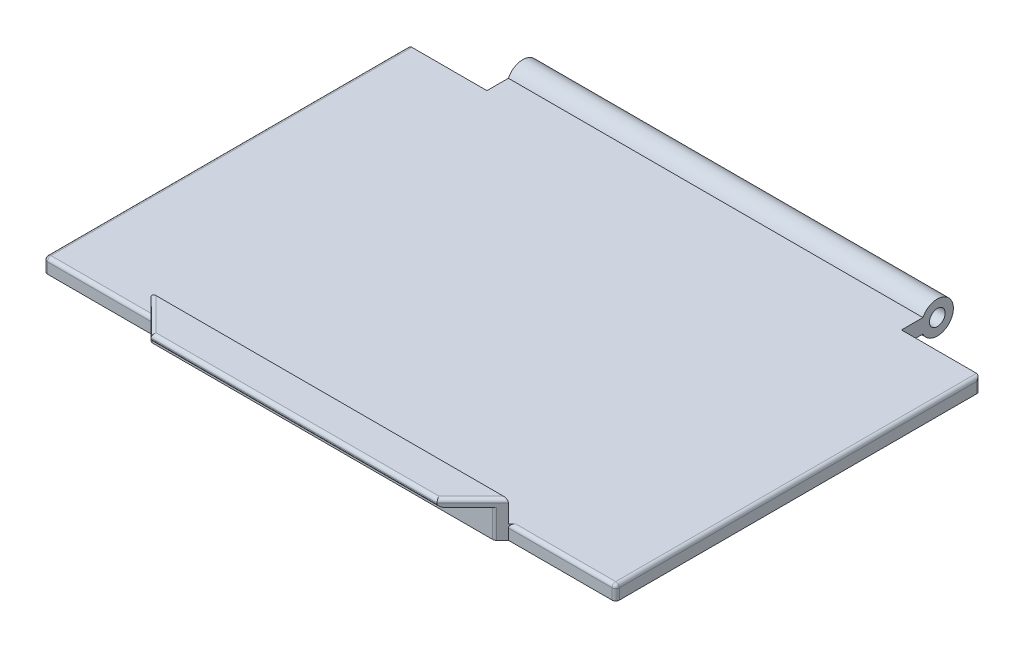
ISO-10303-21;
HEADER;
FILE_DESCRIPTION(('STEP AP214'),'2;1');
FILE_NAME('part.step','',(''),(''),'','','');
FILE_SCHEMA(('AUTOMOTIVE_DESIGN { 1 0 10303 214 1 1 1 1 }'));
ENDSEC;
DATA;
#1=APPLICATION_CONTEXT('core data for automotive mechanical design processes');
#2=APPLICATION_PROTOCOL_DEFINITION('international standard','automotive_design',2000,#1);
#3=PRODUCT_CONTEXT('',#1,'mechanical');
#4=PRODUCT('Part','Part','',(#3));
#5=PRODUCT_RELATED_PRODUCT_CATEGORY('part','',(#4));
#6=PRODUCT_DEFINITION_FORMATION('','',#4);
#7=PRODUCT_DEFINITION_CONTEXT('part definition',#1,'design');
#8=PRODUCT_DEFINITION('design','',#6,#7);
#9=PRODUCT_DEFINITION_SHAPE('','',#8);
#10=(LENGTH_UNIT() NAMED_UNIT(*) SI_UNIT(.MILLI.,.METRE.));
#11=(NAMED_UNIT(*) PLANE_ANGLE_UNIT() SI_UNIT($,.RADIAN.));
#12=(NAMED_UNIT(*) SI_UNIT($,.STERADIAN.) SOLID_ANGLE_UNIT());
#13=UNCERTAINTY_MEASURE_WITH_UNIT(LENGTH_MEASURE(1.E-05),#10,'distance_accuracy_value','');
#14=(GEOMETRIC_REPRESENTATION_CONTEXT(3) GLOBAL_UNCERTAINTY_ASSIGNED_CONTEXT((#13)) GLOBAL_UNIT_ASSIGNED_CONTEXT((#10,
#11,#12)) REPRESENTATION_CONTEXT('',''));
#15=CARTESIAN_POINT('',(0.,0.,0.));
#16=DIRECTION('',(0.,0.,1.));
#17=DIRECTION('',(1.,0.,0.));
#18=AXIS2_PLACEMENT_3D('',#15,#16,#17);
#19=CARTESIAN_POINT('',(-80.,0.,0.));
#20=DIRECTION('',(1.,0.,0.));
#21=DIRECTION('',(0.,0.,-1.));
#22=AXIS2_PLACEMENT_3D('',#19,#20,#21);
#23=CYLINDRICAL_SURFACE('',#22,1.1);
#24=CARTESIAN_POINT('',(-11.,0.,0.));
#25=DIRECTION('',(1.,0.,0.));
#26=DIRECTION('',(0.,0.,-1.));
#27=AXIS2_PLACEMENT_3D('',#24,#25,#26);
#28=CIRCLE('',#27,1.1);
#29=CARTESIAN_POINT('',(-11.,0.,-1.1));
#30=VERTEX_POINT('',#29);
#31=EDGE_CURVE('E295',#30,#30,#28,.F.);
#32=ORIENTED_EDGE('',*,*,#31,.F.);
#33=EDGE_LOOP('',(#32));
#34=FACE_BOUND('',#33,.T.);
#35=CARTESIAN_POINT('',(-69.,0.,0.));
#36=DIRECTION('',(-1.,0.,0.));
#37=DIRECTION('',(0.,0.,1.));
#38=AXIS2_PLACEMENT_3D('',#35,#36,#37);
#39=CIRCLE('',#38,1.1);
#40=CARTESIAN_POINT('',(-69.,0.,1.1));
#41=VERTEX_POINT('',#40);
#42=EDGE_CURVE('E274',#41,#41,#39,.F.);
#43=ORIENTED_EDGE('',*,*,#42,.F.);
#44=EDGE_LOOP('',(#43));
#45=FACE_BOUND('',#44,.T.);
#46=ADVANCED_FACE('F45',(#34,#45),#23,.F.);
#47=CARTESIAN_POINT('',(-80.,0.,0.));
#48=DIRECTION('',(1.,0.,0.));
#49=DIRECTION('',(0.,0.,-1.));
#50=AXIS2_PLACEMENT_3D('',#47,#48,#49);
#51=CYLINDRICAL_SURFACE('',#50,2.25);
#52=DIRECTION('',(1.,0.,0.));
#53=VECTOR('',#52,1.);
#54=CARTESIAN_POINT('',(-80.,-1.,2.01556443707464));
#55=LINE('',#54,#53);
#56=CARTESIAN_POINT('',(-69.,-1.,2.01556443707464));
#57=VERTEX_POINT('',#56);
#58=CARTESIAN_POINT('',(-11.,-1.,2.01556443707464));
#59=VERTEX_POINT('',#58);
#60=EDGE_CURVE('E304',#57,#59,#55,.T.);
#61=ORIENTED_EDGE('',*,*,#60,.F.);
#62=CARTESIAN_POINT('',(-69.,0.,0.));
#63=DIRECTION('',(1.,0.,0.));
#64=DIRECTION('',(0.,0.,-1.));
#65=AXIS2_PLACEMENT_3D('',#62,#63,#64);
#66=CIRCLE('',#65,2.25);
#67=CARTESIAN_POINT('',(-69.,1.,2.01556443707464));
#68=VERTEX_POINT('',#67);
#69=EDGE_CURVE('E259',#57,#68,#66,.T.);
#70=ORIENTED_EDGE('',*,*,#69,.T.);
#71=DIRECTION('',(1.,0.,0.));
#72=VECTOR('',#71,1.);
#73=CARTESIAN_POINT('',(-80.,1.,2.01556443707464));
#74=LINE('',#73,#72);
#75=CARTESIAN_POINT('',(-11.,1.,2.01556443707464));
#76=VERTEX_POINT('',#75);
#77=EDGE_CURVE('E318',#68,#76,#74,.T.);
#78=ORIENTED_EDGE('',*,*,#77,.T.);
#79=CARTESIAN_POINT('',(-11.,0.,0.));
#80=DIRECTION('',(1.,0.,0.));
#81=DIRECTION('',(0.,0.,-1.));
#82=AXIS2_PLACEMENT_3D('',#79,#80,#81);
#83=CIRCLE('',#82,2.25);
#84=EDGE_CURVE('E279',#59,#76,#83,.T.);
#85=ORIENTED_EDGE('',*,*,#84,.F.);
#86=EDGE_LOOP('',(#61,#70,#78,#85));
#87=FACE_BOUND('',#86,.T.);
#88=ADVANCED_FACE('F510',(#87),#51,.T.);
#89=CARTESIAN_POINT('',(-80.,-1.,0.));
#90=DIRECTION('',(0.,1.,0.));
#91=DIRECTION('',(0.,0.,1.));
#92=AXIS2_PLACEMENT_3D('',#89,#90,#91);
#93=PLANE('',#92);
#94=DIRECTION('',(-0.707106781186551,0.,0.707106781186544));
#95=VECTOR('',#94,1.);
#96=CARTESIAN_POINT('',(-19.5000000000004,-1.00000000000001,60.5000000000003));
#97=LINE('',#96,#95);
#98=CARTESIAN_POINT('',(-15.,-1.00000000000001,56.));
#99=VERTEX_POINT('',#98);
#100=CARTESIAN_POINT('',(-15.8535533905933,-1.00000000000001,56.8535533905933));
#101=VERTEX_POINT('',#100);
#102=EDGE_CURVE('E223',#99,#101,#97,.T.);
#103=ORIENTED_EDGE('',*,*,#102,.T.);
#104=CARTESIAN_POINT('',(-16.2071067811866,-1.00000000000001,56.5));
#105=DIRECTION('',(0.,1.,0.));
#106=DIRECTION('',(0.,0.,1.));
#107=AXIS2_PLACEMENT_3D('',#104,#105,#106);
#108=CIRCLE('',#107,0.5);
#109=CARTESIAN_POINT('',(-16.2071067811866,-1.00000000000001,57.));
#110=VERTEX_POINT('',#109);
#111=EDGE_CURVE('E384',#101,#110,#108,.F.);
#112=ORIENTED_EDGE('',*,*,#111,.T.);
#113=DIRECTION('',(1.,0.,0.));
#114=VECTOR('',#113,1.);
#115=CARTESIAN_POINT('',(-80.,-1.00000000000001,57.));
#116=LINE('',#115,#114);
#117=CARTESIAN_POINT('',(-63.7928932188134,-1.00000000000001,57.));
#118=VERTEX_POINT('',#117);
#119=EDGE_CURVE('E306',#118,#110,#116,.T.);
#120=ORIENTED_EDGE('',*,*,#119,.F.);
#121=CARTESIAN_POINT('',(-63.7928932188134,-1.00000000000001,56.5));
#122=DIRECTION('',(0.,1.,0.));
#123=DIRECTION('',(0.,0.,1.));
#124=AXIS2_PLACEMENT_3D('',#121,#122,#123);
#125=CIRCLE('',#124,0.5);
#126=CARTESIAN_POINT('',(-64.1464466094067,-1.00000000000001,56.8535533905933));
#127=VERTEX_POINT('',#126);
#128=EDGE_CURVE('E382',#118,#127,#125,.F.);
#129=ORIENTED_EDGE('',*,*,#128,.T.);
#130=DIRECTION('',(-0.707106781186551,0.,-0.707106781186544));
#131=VECTOR('',#130,1.);
#132=CARTESIAN_POINT('',(-100.5,-1.,20.5000000000003));
#133=LINE('',#132,#131);
#134=CARTESIAN_POINT('',(-65.,-1.00000000000001,56.));
#135=VERTEX_POINT('',#134);
#136=EDGE_CURVE('E254',#127,#135,#133,.T.);
#137=ORIENTED_EDGE('',*,*,#136,.T.);
#138=DIRECTION('',(-1.,0.,0.));
#139=VECTOR('',#138,1.);
#140=CARTESIAN_POINT('',(-80.,-1.00000000000001,56.));
#141=LINE('',#140,#139);
#142=CARTESIAN_POINT('',(-79.5,-1.00000000000001,56.));
#143=VERTEX_POINT('',#142);
#144=EDGE_CURVE('E256',#135,#143,#141,.T.);
#145=ORIENTED_EDGE('',*,*,#144,.T.);
#146=CARTESIAN_POINT('',(-79.5,-1.00000000000001,55.5));
#147=DIRECTION('',(0.,1.,0.));
#148=DIRECTION('',(0.,0.,1.));
#149=AXIS2_PLACEMENT_3D('',#146,#147,#148);
#150=CIRCLE('',#149,0.5);
#151=CARTESIAN_POINT('',(-80.,-1.00000000000001,55.5));
#152=VERTEX_POINT('',#151);
#153=EDGE_CURVE('E375',#143,#152,#150,.F.);
#154=ORIENTED_EDGE('',*,*,#153,.T.);
#155=DIRECTION('',(0.,0.,1.));
#156=VECTOR('',#155,1.);
#157=CARTESIAN_POINT('',(-80.,-1.,0.));
#158=LINE('',#157,#156);
#159=CARTESIAN_POINT('',(-80.,-1.,5.51556443707464));
#160=VERTEX_POINT('',#159);
#161=EDGE_CURVE('E301',#160,#152,#158,.T.);
#162=ORIENTED_EDGE('',*,*,#161,.F.);
#163=CARTESIAN_POINT('',(-79.5,-1.,5.51556443707464));
#164=DIRECTION('',(0.,1.,0.));
#165=DIRECTION('',(0.,0.,1.));
#166=AXIS2_PLACEMENT_3D('',#163,#164,#165);
#167=CIRCLE('',#166,0.5);
#168=CARTESIAN_POINT('',(-79.5,-1.,5.01556443707464));
#169=VERTEX_POINT('',#168);
#170=EDGE_CURVE('E377',#160,#169,#167,.F.);
#171=ORIENTED_EDGE('',*,*,#170,.T.);
#172=DIRECTION('',(-1.,0.,0.));
#173=VECTOR('',#172,1.);
#174=CARTESIAN_POINT('',(-69.,-1.,5.01556443707464));
#175=LINE('',#174,#173);
#176=CARTESIAN_POINT('',(-69.,-1.,5.01556443707464));
#177=VERTEX_POINT('',#176);
#178=EDGE_CURVE('E270',#177,#169,#175,.T.);
#179=ORIENTED_EDGE('',*,*,#178,.F.);
#180=DIRECTION('',(0.,0.,-1.));
#181=VECTOR('',#180,1.);
#182=CARTESIAN_POINT('',(-69.,-1.,5.01556443707464));
#183=LINE('',#182,#181);
#184=EDGE_CURVE('E262',#177,#57,#183,.T.);
#185=ORIENTED_EDGE('',*,*,#184,.T.);
#186=ORIENTED_EDGE('',*,*,#60,.T.);
#187=DIRECTION('',(0.,0.,-1.));
#188=VECTOR('',#187,1.);
#189=CARTESIAN_POINT('',(-11.,-1.,5.01556443707464));
#190=LINE('',#189,#188);
#191=CARTESIAN_POINT('',(-11.,-1.,5.01556443707464));
#192=VERTEX_POINT('',#191);
#193=EDGE_CURVE('E288',#192,#59,#190,.T.);
#194=ORIENTED_EDGE('',*,*,#193,.F.);
#195=DIRECTION('',(1.,0.,0.));
#196=VECTOR('',#195,1.);
#197=CARTESIAN_POINT('',(-11.,-1.,5.01556443707464));
#198=LINE('',#197,#196);
#199=CARTESIAN_POINT('',(-0.5,-1.,5.01556443707464));
#200=VERTEX_POINT('',#199);
#201=EDGE_CURVE('E292',#192,#200,#198,.T.);
#202=ORIENTED_EDGE('',*,*,#201,.T.);
#203=CARTESIAN_POINT('',(-0.5,-1.,5.51556443707464));
#204=DIRECTION('',(0.,1.,0.));
#205=DIRECTION('',(0.,0.,1.));
#206=AXIS2_PLACEMENT_3D('',#203,#204,#205);
#207=CIRCLE('',#206,0.5);
#208=CARTESIAN_POINT('',(0.,-1.,5.51556443707464));
#209=VERTEX_POINT('',#208);
#210=EDGE_CURVE('E380',#200,#209,#207,.F.);
#211=ORIENTED_EDGE('',*,*,#210,.T.);
#212=DIRECTION('',(0.,0.,1.));
#213=VECTOR('',#212,1.);
#214=CARTESIAN_POINT('',(0.,-1.,0.));
#215=LINE('',#214,#213);
#216=CARTESIAN_POINT('',(0.,-1.00000000000001,55.5));
#217=VERTEX_POINT('',#216);
#218=EDGE_CURVE('E300',#209,#217,#215,.T.);
#219=ORIENTED_EDGE('',*,*,#218,.T.);
#220=CARTESIAN_POINT('',(-0.5,-1.00000000000001,55.5));
#221=DIRECTION('',(0.,1.,0.));
#222=DIRECTION('',(0.,0.,1.));
#223=AXIS2_PLACEMENT_3D('',#220,#221,#222);
#224=CIRCLE('',#223,0.5);
#225=CARTESIAN_POINT('',(-0.5,-1.00000000000001,56.));
#226=VERTEX_POINT('',#225);
#227=EDGE_CURVE('E227',#217,#226,#224,.F.);
#228=ORIENTED_EDGE('',*,*,#227,.T.);
#229=DIRECTION('',(-1.,0.,0.));
#230=VECTOR('',#229,1.);
#231=CARTESIAN_POINT('',(-80.,-1.00000000000001,56.));
#232=LINE('',#231,#230);
#233=EDGE_CURVE('E220',#226,#99,#232,.T.);
#234=ORIENTED_EDGE('',*,*,#233,.T.);
#235=EDGE_LOOP('',(#103,#112,#120,#129,#137,#145,#154,#162,#171,#179,#185,#186,#194,#202,#211,
#219,#228,#234));
#236=FACE_BOUND('',#235,.T.);
#237=ADVANCED_FACE('F222',(#236),#93,.F.);
#238=CARTESIAN_POINT('',(-80.,1.,0.));
#239=DIRECTION('',(0.,1.,0.));
#240=DIRECTION('',(0.,0.,1.));
#241=AXIS2_PLACEMENT_3D('',#238,#239,#240);
#242=PLANE('',#241);
#243=DIRECTION('',(1.,0.,0.));
#244=VECTOR('',#243,1.);
#245=CARTESIAN_POINT('',(-80.,0.999999999999993,56.));
#246=LINE('',#245,#244);
#247=CARTESIAN_POINT('',(-65.,0.999999999999992,56.));
#248=VERTEX_POINT('',#247);
#249=CARTESIAN_POINT('',(-15.,0.999999999999992,56.));
#250=VERTEX_POINT('',#249);
#251=EDGE_CURVE('E316',#248,#250,#246,.T.);
#252=ORIENTED_EDGE('',*,*,#251,.T.);
#253=DIRECTION('',(0.707106781186551,0.,-0.707106781186544));
#254=VECTOR('',#253,1.);
#255=CARTESIAN_POINT('',(-15.,0.999999999999993,56.));
#256=LINE('',#255,#254);
#257=CARTESIAN_POINT('',(-14.5,0.999999999999993,55.5));
#258=VERTEX_POINT('',#257);
#259=EDGE_CURVE('E62',#250,#258,#256,.T.);
#260=ORIENTED_EDGE('',*,*,#259,.T.);
#261=DIRECTION('',(-1.,0.,0.));
#262=VECTOR('',#261,1.);
#263=CARTESIAN_POINT('',(0.,0.999999999999993,55.5));
#264=LINE('',#263,#262);
#265=CARTESIAN_POINT('',(-0.5,0.999999999999993,55.5));
#266=VERTEX_POINT('',#265);
#267=EDGE_CURVE('E332',#258,#266,#264,.F.);
#268=ORIENTED_EDGE('',*,*,#267,.T.);
#269=DIRECTION('',(0.,0.,1.));
#270=VECTOR('',#269,1.);
#271=CARTESIAN_POINT('',(-0.5,1.,0.));
#272=LINE('',#271,#270);
#273=CARTESIAN_POINT('',(-0.5,1.,5.01556443707464));
#274=VERTEX_POINT('',#273);
#275=EDGE_CURVE('E330',#266,#274,#272,.F.);
#276=ORIENTED_EDGE('',*,*,#275,.T.);
#277=DIRECTION('',(1.,0.,0.));
#278=VECTOR('',#277,1.);
#279=CARTESIAN_POINT('',(-11.,1.,5.01556443707464));
#280=LINE('',#279,#278);
#281=CARTESIAN_POINT('',(-11.,1.,5.01556443707464));
#282=VERTEX_POINT('',#281);
#283=EDGE_CURVE('E291',#282,#274,#280,.T.);
#284=ORIENTED_EDGE('',*,*,#283,.F.);
#285=DIRECTION('',(0.,0.,1.));
#286=VECTOR('',#285,1.);
#287=CARTESIAN_POINT('',(-11.,1.,2.01556443707464));
#288=LINE('',#287,#286);
#289=EDGE_CURVE('E282',#76,#282,#288,.T.);
#290=ORIENTED_EDGE('',*,*,#289,.F.);
#291=ORIENTED_EDGE('',*,*,#77,.F.);
#292=DIRECTION('',(0.,0.,1.));
#293=VECTOR('',#292,1.);
#294=CARTESIAN_POINT('',(-69.,1.,2.01556443707464));
#295=LINE('',#294,#293);
#296=CARTESIAN_POINT('',(-69.,1.,5.01556443707464));
#297=VERTEX_POINT('',#296);
#298=EDGE_CURVE('E267',#68,#297,#295,.T.);
#299=ORIENTED_EDGE('',*,*,#298,.T.);
#300=DIRECTION('',(-1.,0.,0.));
#301=VECTOR('',#300,1.);
#302=CARTESIAN_POINT('',(-69.,1.,5.01556443707464));
#303=LINE('',#302,#301);
#304=CARTESIAN_POINT('',(-79.5,1.,5.01556443707464));
#305=VERTEX_POINT('',#304);
#306=EDGE_CURVE('E271',#297,#305,#303,.T.);
#307=ORIENTED_EDGE('',*,*,#306,.T.);
#308=DIRECTION('',(0.,0.,1.));
#309=VECTOR('',#308,1.);
#310=CARTESIAN_POINT('',(-79.5,0.999999999999993,56.));
#311=LINE('',#310,#309);
#312=CARTESIAN_POINT('',(-79.5,0.999999999999993,55.5));
#313=VERTEX_POINT('',#312);
#314=EDGE_CURVE('E323',#305,#313,#311,.T.);
#315=ORIENTED_EDGE('',*,*,#314,.T.);
#316=DIRECTION('',(1.,0.,0.));
#317=VECTOR('',#316,1.);
#318=CARTESIAN_POINT('',(-65.,0.999999999999993,55.5));
#319=LINE('',#318,#317);
#320=CARTESIAN_POINT('',(-65.5,0.999999999999993,55.5));
#321=VERTEX_POINT('',#320);
#322=EDGE_CURVE('E325',#313,#321,#319,.T.);
#323=ORIENTED_EDGE('',*,*,#322,.T.);
#324=DIRECTION('',(0.707106781186551,0.,0.707106781186544));
#325=VECTOR('',#324,1.);
#326=CARTESIAN_POINT('',(-65.,0.999999999999993,56.));
#327=LINE('',#326,#325);
#328=EDGE_CURVE('E328',#321,#248,#327,.T.);
#329=ORIENTED_EDGE('',*,*,#328,.T.);
#330=EDGE_LOOP('',(#252,#260,#268,#276,#284,#290,#291,#299,#307,#315,#323,#329));
#331=FACE_BOUND('',#330,.T.);
#332=ADVANCED_FACE('F496',(#331),#242,.T.);
#333=CARTESIAN_POINT('',(-80.,0.,0.));
#334=DIRECTION('',(1.,0.,0.));
#335=DIRECTION('',(0.,0.,-1.));
#336=AXIS2_PLACEMENT_3D('',#333,#334,#335);
#337=PLANE('',#336);
#338=DIRECTION('',(0.,0.,1.));
#339=VECTOR('',#338,1.);
#340=CARTESIAN_POINT('',(-80.,0.499999999999999,5.01556443707464));
#341=LINE('',#340,#339);
#342=CARTESIAN_POINT('',(-80.,0.499999999999993,55.5));
#343=VERTEX_POINT('',#342);
#344=CARTESIAN_POINT('',(-80.,0.499999999999999,5.51556443707464));
#345=VERTEX_POINT('',#344);
#346=EDGE_CURVE('E350',#343,#345,#341,.F.);
#347=ORIENTED_EDGE('',*,*,#346,.T.);
#348=DIRECTION('',(0.,-1.,0.));
#349=VECTOR('',#348,1.);
#350=CARTESIAN_POINT('',(-80.,-1.,5.51556443707464));
#351=LINE('',#350,#349);
#352=EDGE_CURVE('E352',#345,#160,#351,.T.);
#353=ORIENTED_EDGE('',*,*,#352,.T.);
#354=ORIENTED_EDGE('',*,*,#161,.T.);
#355=DIRECTION('',(0.,1.,0.));
#356=VECTOR('',#355,1.);
#357=CARTESIAN_POINT('',(-80.,0.,55.5));
#358=LINE('',#357,#356);
#359=EDGE_CURVE('E348',#152,#343,#358,.T.);
#360=ORIENTED_EDGE('',*,*,#359,.T.);
#361=EDGE_LOOP('',(#347,#353,#354,#360));
#362=FACE_BOUND('',#361,.T.);
#363=ADVANCED_FACE('F485',(#362),#337,.F.);
#364=CARTESIAN_POINT('',(-80.,0.,57.));
#365=DIRECTION('',(0.,0.,-1.));
#366=DIRECTION('',(-1.,0.,0.));
#367=AXIS2_PLACEMENT_3D('',#364,#365,#366);
#368=PLANE('',#367);
#369=ORIENTED_EDGE('',*,*,#119,.T.);
#370=DIRECTION('',(0.,1.,0.));
#371=VECTOR('',#370,1.);
#372=CARTESIAN_POINT('',(-16.2071067811866,0.,57.));
#373=LINE('',#372,#371);
#374=CARTESIAN_POINT('',(-16.2071067811866,2.99999999999999,57.));
#375=VERTEX_POINT('',#374);
#376=EDGE_CURVE('E372',#110,#375,#373,.T.);
#377=ORIENTED_EDGE('',*,*,#376,.T.);
#378=DIRECTION('',(1.,0.,0.));
#379=VECTOR('',#378,1.);
#380=CARTESIAN_POINT('',(-80.,2.99999999999999,57.));
#381=LINE('',#380,#379);
#382=CARTESIAN_POINT('',(-63.7928932188134,2.99999999999999,57.));
#383=VERTEX_POINT('',#382);
#384=EDGE_CURVE('E310',#383,#375,#381,.T.);
#385=ORIENTED_EDGE('',*,*,#384,.F.);
#386=DIRECTION('',(0.,-1.,0.));
#387=VECTOR('',#386,1.);
#388=CARTESIAN_POINT('',(-63.7928932188134,0.,57.));
#389=LINE('',#388,#387);
#390=EDGE_CURVE('E369',#383,#118,#389,.T.);
#391=ORIENTED_EDGE('',*,*,#390,.T.);
#392=EDGE_LOOP('',(#369,#377,#385,#391));
#393=FACE_BOUND('',#392,.T.);
#394=ADVANCED_FACE('F455',(#393),#368,.F.);
#395=CARTESIAN_POINT('',(-80.,3.,0.));
#396=DIRECTION('',(0.,1.,0.));
#397=DIRECTION('',(0.,0.,1.));
#398=AXIS2_PLACEMENT_3D('',#395,#396,#397);
#399=PLANE('',#398);
#400=DIRECTION('',(-0.707106781186551,0.,0.707106781186544));
#401=VECTOR('',#400,1.);
#402=CARTESIAN_POINT('',(-19.5000000000004,2.99999999999999,60.5000000000003));
#403=LINE('',#402,#401);
#404=CARTESIAN_POINT('',(-15.8535533905933,2.99999999999999,56.8535533905933));
#405=VERTEX_POINT('',#404);
#406=CARTESIAN_POINT('',(-19.5,2.99999999999999,60.5));
#407=VERTEX_POINT('',#406);
#408=EDGE_CURVE('E231',#405,#407,#403,.T.);
#409=ORIENTED_EDGE('',*,*,#408,.T.);
#410=DIRECTION('',(1.,0.,0.));
#411=VECTOR('',#410,1.);
#412=CARTESIAN_POINT('',(-80.,2.99999999999999,60.5));
#413=LINE('',#412,#411);
#414=CARTESIAN_POINT('',(-60.5,2.99999999999999,60.5));
#415=VERTEX_POINT('',#414);
#416=EDGE_CURVE('E359',#407,#415,#413,.F.);
#417=ORIENTED_EDGE('',*,*,#416,.T.);
#418=DIRECTION('',(-0.707106781186551,0.,-0.707106781186544));
#419=VECTOR('',#418,1.);
#420=CARTESIAN_POINT('',(-100.5,3.,20.5000000000003));
#421=LINE('',#420,#419);
#422=CARTESIAN_POINT('',(-64.1464466094067,2.99999999999999,56.8535533905933));
#423=VERTEX_POINT('',#422);
#424=EDGE_CURVE('E239',#415,#423,#421,.T.);
#425=ORIENTED_EDGE('',*,*,#424,.T.);
#426=CARTESIAN_POINT('',(-63.7928932188134,2.99999999999999,56.5));
#427=DIRECTION('',(0.,1.,0.));
#428=DIRECTION('',(0.,0.,1.));
#429=AXIS2_PLACEMENT_3D('',#426,#427,#428);
#430=CIRCLE('',#429,0.5);
#431=EDGE_CURVE('E11',#423,#383,#430,.T.);
#432=ORIENTED_EDGE('',*,*,#431,.T.);
#433=ORIENTED_EDGE('',*,*,#384,.T.);
#434=CARTESIAN_POINT('',(-16.2071067811866,2.99999999999999,56.5));
#435=DIRECTION('',(0.,1.,0.));
#436=DIRECTION('',(0.,0.,1.));
#437=AXIS2_PLACEMENT_3D('',#434,#435,#436);
#438=CIRCLE('',#437,0.5);
#439=EDGE_CURVE('E54',#375,#405,#438,.T.);
#440=ORIENTED_EDGE('',*,*,#439,.T.);
#441=EDGE_LOOP('',(#409,#417,#425,#432,#433,#440));
#442=FACE_BOUND('',#441,.T.);
#443=ADVANCED_FACE('F447',(#442),#399,.F.);
#444=CARTESIAN_POINT('',(-80.,3.99999999999998,0.));
#445=DIRECTION('',(0.,-1.,0.));
#446=DIRECTION('',(0.,0.,-1.));
#447=AXIS2_PLACEMENT_3D('',#444,#445,#446);
#448=PLANE('',#447);
#449=DIRECTION('',(1.,0.,0.));
#450=VECTOR('',#449,1.);
#451=CARTESIAN_POINT('',(-80.,3.99999999999999,60.5));
#452=LINE('',#451,#450);
#453=CARTESIAN_POINT('',(-59.7928932188134,3.99999999999999,60.5));
#454=VERTEX_POINT('',#453);
#455=CARTESIAN_POINT('',(-20.2071067811866,3.99999999999999,60.5));
#456=VERTEX_POINT('',#455);
#457=EDGE_CURVE('E70',#454,#456,#452,.T.);
#458=ORIENTED_EDGE('',*,*,#457,.T.);
#459=DIRECTION('',(-0.707106781186551,0.,0.707106781186544));
#460=VECTOR('',#459,1.);
#461=CARTESIAN_POINT('',(-19.8535533905936,3.99999999999999,60.146446609407));
#462=LINE('',#461,#460);
#463=CARTESIAN_POINT('',(-15.7071067811865,3.99999999999999,56.));
#464=VERTEX_POINT('',#463);
#465=EDGE_CURVE('E389',#456,#464,#462,.F.);
#466=ORIENTED_EDGE('',*,*,#465,.T.);
#467=DIRECTION('',(1.,0.,0.));
#468=VECTOR('',#467,1.);
#469=CARTESIAN_POINT('',(-80.,3.99999999999999,56.));
#470=LINE('',#469,#468);
#471=CARTESIAN_POINT('',(-64.2928932188135,3.99999999999999,56.));
#472=VERTEX_POINT('',#471);
#473=EDGE_CURVE('E313',#472,#464,#470,.T.);
#474=ORIENTED_EDGE('',*,*,#473,.F.);
#475=DIRECTION('',(-0.707106781186551,0.,-0.707106781186544));
#476=VECTOR('',#475,1.);
#477=CARTESIAN_POINT('',(-100.146446609407,3.99999999999999,20.146446609407));
#478=LINE('',#477,#476);
#479=EDGE_CURVE('E387',#472,#454,#478,.F.);
#480=ORIENTED_EDGE('',*,*,#479,.T.);
#481=EDGE_LOOP('',(#458,#466,#474,#480));
#482=FACE_BOUND('',#481,.T.);
#483=ADVANCED_FACE('F551',(#482),#448,.F.);
#484=CARTESIAN_POINT('',(-80.,0.,56.));
#485=DIRECTION('',(0.,0.,1.));
#486=DIRECTION('',(1.,0.,0.));
#487=AXIS2_PLACEMENT_3D('',#484,#485,#486);
#488=PLANE('',#487);
#489=ORIENTED_EDGE('',*,*,#473,.T.);
#490=CARTESIAN_POINT('',(-15.7071067811865,3.49999999999999,56.));
#491=DIRECTION('',(0.,0.,1.));
#492=DIRECTION('',(-1.,0.,0.));
#493=AXIS2_PLACEMENT_3D('',#490,#491,#492);
#494=ELLIPSE('',#493,0.707106781186551,0.5);
#495=CARTESIAN_POINT('',(-15.,3.49999999999999,56.));
#496=VERTEX_POINT('',#495);
#497=EDGE_CURVE('E393',#464,#496,#494,.F.);
#498=ORIENTED_EDGE('',*,*,#497,.T.);
#499=DIRECTION('',(0.,1.,0.));
#500=VECTOR('',#499,1.);
#501=CARTESIAN_POINT('',(-15.,-2.25,56.));
#502=LINE('',#501,#500);
#503=EDGE_CURVE('E245',#250,#496,#502,.T.);
#504=ORIENTED_EDGE('',*,*,#503,.F.);
#505=ORIENTED_EDGE('',*,*,#251,.F.);
#506=DIRECTION('',(0.,1.,0.));
#507=VECTOR('',#506,1.);
#508=CARTESIAN_POINT('',(-65.,0.,56.));
#509=LINE('',#508,#507);
#510=CARTESIAN_POINT('',(-65.,3.49999999999999,56.));
#511=VERTEX_POINT('',#510);
#512=EDGE_CURVE('E309',#248,#511,#509,.T.);
#513=ORIENTED_EDGE('',*,*,#512,.T.);
#514=CARTESIAN_POINT('',(-64.2928932188135,3.49999999999999,56.));
#515=DIRECTION('',(0.,0.,1.));
#516=DIRECTION('',(-1.,0.,0.));
#517=AXIS2_PLACEMENT_3D('',#514,#515,#516);
#518=ELLIPSE('',#517,0.707106781186551,0.5);
#519=EDGE_CURVE('E391',#511,#472,#518,.F.);
#520=ORIENTED_EDGE('',*,*,#519,.T.);
#521=EDGE_LOOP('',(#489,#498,#504,#505,#513,#520));
#522=FACE_BOUND('',#521,.T.);
#523=ADVANCED_FACE('F546',(#522),#488,.F.);
#524=CARTESIAN_POINT('',(0.,0.,0.));
#525=DIRECTION('',(1.,0.,0.));
#526=DIRECTION('',(0.,0.,-1.));
#527=AXIS2_PLACEMENT_3D('',#524,#525,#526);
#528=PLANE('',#527);
#529=ORIENTED_EDGE('',*,*,#218,.F.);
#530=DIRECTION('',(0.,-1.,0.));
#531=VECTOR('',#530,1.);
#532=CARTESIAN_POINT('',(0.,0.999999999999999,5.51556443707464));
#533=LINE('',#532,#531);
#534=CARTESIAN_POINT('',(0.,0.499999999999999,5.51556443707464));
#535=VERTEX_POINT('',#534);
#536=EDGE_CURVE('E346',#209,#535,#533,.F.);
#537=ORIENTED_EDGE('',*,*,#536,.T.);
#538=DIRECTION('',(0.,0.,1.));
#539=VECTOR('',#538,1.);
#540=CARTESIAN_POINT('',(0.,0.5,0.));
#541=LINE('',#540,#539);
#542=CARTESIAN_POINT('',(0.,0.499999999999993,55.5));
#543=VERTEX_POINT('',#542);
#544=EDGE_CURVE('E344',#535,#543,#541,.T.);
#545=ORIENTED_EDGE('',*,*,#544,.T.);
#546=DIRECTION('',(0.,1.,0.));
#547=VECTOR('',#546,1.);
#548=CARTESIAN_POINT('',(0.,-1.00000000000001,55.5));
#549=LINE('',#548,#547);
#550=EDGE_CURVE('E342',#543,#217,#549,.F.);
#551=ORIENTED_EDGE('',*,*,#550,.T.);
#552=EDGE_LOOP('',(#529,#537,#545,#551));
#553=FACE_BOUND('',#552,.T.);
#554=ADVANCED_FACE('F532',(#553),#528,.T.);
#555=CARTESIAN_POINT('',(-11.,0.,0.));
#556=DIRECTION('',(1.,0.,0.));
#557=DIRECTION('',(0.,0.,-1.));
#558=AXIS2_PLACEMENT_3D('',#555,#556,#557);
#559=PLANE('',#558);
#560=ORIENTED_EDGE('',*,*,#84,.T.);
#561=ORIENTED_EDGE('',*,*,#289,.T.);
#562=DIRECTION('',(0.,-1.,0.));
#563=VECTOR('',#562,1.);
#564=CARTESIAN_POINT('',(-11.,1.,5.01556443707464));
#565=LINE('',#564,#563);
#566=EDGE_CURVE('E285',#282,#192,#565,.T.);
#567=ORIENTED_EDGE('',*,*,#566,.T.);
#568=ORIENTED_EDGE('',*,*,#193,.T.);
#569=EDGE_LOOP('',(#560,#561,#567,#568));
#570=FACE_BOUND('',#569,.T.);
#571=ORIENTED_EDGE('',*,*,#31,.T.);
#572=EDGE_LOOP('',(#571));
#573=FACE_BOUND('',#572,.T.);
#574=ADVANCED_FACE('F513',(#570,#573),#559,.T.);
#575=CARTESIAN_POINT('',(-11.,1.,5.01556443707464));
#576=DIRECTION('',(0.,0.,1.));
#577=DIRECTION('',(1.,0.,0.));
#578=AXIS2_PLACEMENT_3D('',#575,#576,#577);
#579=PLANE('',#578);
#580=ORIENTED_EDGE('',*,*,#283,.T.);
#581=DIRECTION('',(0.,-1.,0.));
#582=VECTOR('',#581,1.);
#583=CARTESIAN_POINT('',(-0.5,-1.,5.01556443707464));
#584=LINE('',#583,#582);
#585=EDGE_CURVE('E395',#274,#200,#584,.T.);
#586=ORIENTED_EDGE('',*,*,#585,.T.);
#587=ORIENTED_EDGE('',*,*,#201,.F.);
#588=ORIENTED_EDGE('',*,*,#566,.F.);
#589=EDGE_LOOP('',(#580,#586,#587,#588));
#590=FACE_BOUND('',#589,.T.);
#591=ADVANCED_FACE('F519',(#590),#579,.F.);
#592=CARTESIAN_POINT('',(-69.,0.,0.));
#593=DIRECTION('',(-1.,0.,0.));
#594=DIRECTION('',(0.,0.,-1.));
#595=AXIS2_PLACEMENT_3D('',#592,#593,#594);
#596=PLANE('',#595);
#597=ORIENTED_EDGE('',*,*,#69,.F.);
#598=ORIENTED_EDGE('',*,*,#184,.F.);
#599=DIRECTION('',(0.,-1.,0.));
#600=VECTOR('',#599,1.);
#601=CARTESIAN_POINT('',(-69.,1.,5.01556443707464));
#602=LINE('',#601,#600);
#603=EDGE_CURVE('E265',#297,#177,#602,.T.);
#604=ORIENTED_EDGE('',*,*,#603,.F.);
#605=ORIENTED_EDGE('',*,*,#298,.F.);
#606=EDGE_LOOP('',(#597,#598,#604,#605));
#607=FACE_BOUND('',#606,.T.);
#608=ORIENTED_EDGE('',*,*,#42,.T.);
#609=EDGE_LOOP('',(#608));
#610=FACE_BOUND('',#609,.T.);
#611=ADVANCED_FACE('F503',(#607,#610),#596,.T.);
#612=CARTESIAN_POINT('',(-69.,1.,5.01556443707464));
#613=DIRECTION('',(0.,0.,-1.));
#614=DIRECTION('',(-1.,0.,0.));
#615=AXIS2_PLACEMENT_3D('',#612,#613,#614);
#616=PLANE('',#615);
#617=ORIENTED_EDGE('',*,*,#178,.T.);
#618=DIRECTION('',(0.,-1.,0.));
#619=VECTOR('',#618,1.);
#620=CARTESIAN_POINT('',(-79.5,1.,5.01556443707464));
#621=LINE('',#620,#619);
#622=EDGE_CURVE('E397',#169,#305,#621,.F.);
#623=ORIENTED_EDGE('',*,*,#622,.T.);
#624=ORIENTED_EDGE('',*,*,#306,.F.);
#625=ORIENTED_EDGE('',*,*,#603,.T.);
#626=EDGE_LOOP('',(#617,#623,#624,#625));
#627=FACE_BOUND('',#626,.T.);
#628=ADVANCED_FACE('F500',(#627),#616,.T.);
#629=CARTESIAN_POINT('',(-15.,-2.25,56.));
#630=DIRECTION('',(-0.707106781186544,0.,-0.707106781186551));
#631=DIRECTION('',(-0.707106781186551,0.,0.707106781186544));
#632=AXIS2_PLACEMENT_3D('',#629,#630,#631);
#633=PLANE('',#632);
#634=ORIENTED_EDGE('',*,*,#408,.F.);
#635=DIRECTION('',(0.,1.,0.));
#636=VECTOR('',#635,1.);
#637=CARTESIAN_POINT('',(-15.8535533905933,-2.25,56.8535533905933));
#638=LINE('',#637,#636);
#639=EDGE_CURVE('E238',#405,#101,#638,.F.);
#640=ORIENTED_EDGE('',*,*,#639,.T.);
#641=ORIENTED_EDGE('',*,*,#102,.F.);
#642=CARTESIAN_POINT('',(-15.,0.499999999999993,56.));
#643=VERTEX_POINT('',#642);
#644=EDGE_CURVE('E236',#99,#643,#502,.T.);
#645=ORIENTED_EDGE('',*,*,#644,.T.);
#646=CARTESIAN_POINT('',(-14.5,0.499999999999994,55.5));
#647=DIRECTION('',(-0.707106781186544,0.,-0.707106781186551));
#648=DIRECTION('',(0.707106781186551,0.,-0.707106781186544));
#649=AXIS2_PLACEMENT_3D('',#646,#647,#648);
#650=ELLIPSE('',#649,0.707106781186552,0.5);
#651=EDGE_CURVE('E401',#643,#258,#650,.T.);
#652=ORIENTED_EDGE('',*,*,#651,.T.);
#653=ORIENTED_EDGE('',*,*,#259,.F.);
#654=ORIENTED_EDGE('',*,*,#503,.T.);
#655=DIRECTION('',(-0.707106781186551,0.,0.707106781186544));
#656=VECTOR('',#655,1.);
#657=CARTESIAN_POINT('',(-15.,3.49999999999999,56.));
#658=LINE('',#657,#656);
#659=CARTESIAN_POINT('',(-20.0000000000001,3.49999999999999,61.));
#660=VERTEX_POINT('',#659);
#661=EDGE_CURVE('E354',#496,#660,#658,.T.);
#662=ORIENTED_EDGE('',*,*,#661,.T.);
#663=CARTESIAN_POINT('',(-19.5,3.49999999999999,60.5));
#664=DIRECTION('',(-0.707106781186544,0.,-0.707106781186551));
#665=DIRECTION('',(0.707106781186551,0.,-0.707106781186544));
#666=AXIS2_PLACEMENT_3D('',#663,#664,#665);
#667=ELLIPSE('',#666,0.707106781186552,0.5);
#668=EDGE_CURVE('E356',#660,#407,#667,.F.);
#669=ORIENTED_EDGE('',*,*,#668,.T.);
#670=EDGE_LOOP('',(#634,#640,#641,#645,#652,#653,#654,#662,#669));
#671=FACE_BOUND('',#670,.T.);
#672=ADVANCED_FACE('F235',(#671),#633,.F.);
#673=CARTESIAN_POINT('',(-15.,-2.25,56.));
#674=DIRECTION('',(0.,0.,-1.));
#675=DIRECTION('',(-1.,0.,0.));
#676=AXIS2_PLACEMENT_3D('',#673,#674,#675);
#677=PLANE('',#676);
#678=DIRECTION('',(0.,1.,0.));
#679=VECTOR('',#678,1.);
#680=CARTESIAN_POINT('',(-0.5,0.999999999999996,56.));
#681=LINE('',#680,#679);
#682=CARTESIAN_POINT('',(-0.5,0.499999999999994,56.));
#683=VERTEX_POINT('',#682);
#684=EDGE_CURVE('E339',#226,#683,#681,.T.);
#685=ORIENTED_EDGE('',*,*,#684,.T.);
#686=DIRECTION('',(-1.,0.,0.));
#687=VECTOR('',#686,1.);
#688=CARTESIAN_POINT('',(-15.,0.499999999999994,56.));
#689=LINE('',#688,#687);
#690=EDGE_CURVE('E244',#683,#643,#689,.T.);
#691=ORIENTED_EDGE('',*,*,#690,.T.);
#692=ORIENTED_EDGE('',*,*,#644,.F.);
#693=ORIENTED_EDGE('',*,*,#233,.F.);
#694=EDGE_LOOP('',(#685,#691,#692,#693));
#695=FACE_BOUND('',#694,.T.);
#696=ADVANCED_FACE('F242',(#695),#677,.F.);
#697=CARTESIAN_POINT('',(-65.,-2.25,56.));
#698=DIRECTION('',(0.,0.,-1.));
#699=DIRECTION('',(-1.,0.,0.));
#700=AXIS2_PLACEMENT_3D('',#697,#698,#699);
#701=PLANE('',#700);
#702=DIRECTION('',(0.,1.,0.));
#703=VECTOR('',#702,1.);
#704=CARTESIAN_POINT('',(-65.,-2.25,56.));
#705=LINE('',#704,#703);
#706=CARTESIAN_POINT('',(-65.,0.499999999999993,56.));
#707=VERTEX_POINT('',#706);
#708=EDGE_CURVE('E232',#135,#707,#705,.T.);
#709=ORIENTED_EDGE('',*,*,#708,.T.);
#710=DIRECTION('',(1.,0.,0.));
#711=VECTOR('',#710,1.);
#712=CARTESIAN_POINT('',(-80.,0.499999999999993,56.));
#713=LINE('',#712,#711);
#714=CARTESIAN_POINT('',(-79.5,0.499999999999993,56.));
#715=VERTEX_POINT('',#714);
#716=EDGE_CURVE('E337',#707,#715,#713,.F.);
#717=ORIENTED_EDGE('',*,*,#716,.T.);
#718=DIRECTION('',(0.,1.,0.));
#719=VECTOR('',#718,1.);
#720=CARTESIAN_POINT('',(-79.5,-2.25,56.));
#721=LINE('',#720,#719);
#722=EDGE_CURVE('E335',#715,#143,#721,.F.);
#723=ORIENTED_EDGE('',*,*,#722,.T.);
#724=ORIENTED_EDGE('',*,*,#144,.F.);
#725=EDGE_LOOP('',(#709,#717,#723,#724));
#726=FACE_BOUND('',#725,.T.);
#727=ADVANCED_FACE('F468',(#726),#701,.F.);
#728=CARTESIAN_POINT('',(-65.,-2.25,56.));
#729=DIRECTION('',(0.707106781186544,0.,-0.707106781186551));
#730=DIRECTION('',(-0.707106781186551,0.,-0.707106781186544));
#731=AXIS2_PLACEMENT_3D('',#728,#729,#730);
#732=PLANE('',#731);
#733=ORIENTED_EDGE('',*,*,#136,.F.);
#734=DIRECTION('',(0.,-1.,0.));
#735=VECTOR('',#734,1.);
#736=CARTESIAN_POINT('',(-64.1464466094067,-2.25,56.8535533905933));
#737=LINE('',#736,#735);
#738=EDGE_CURVE('E366',#127,#423,#737,.F.);
#739=ORIENTED_EDGE('',*,*,#738,.T.);
#740=ORIENTED_EDGE('',*,*,#424,.F.);
#741=CARTESIAN_POINT('',(-60.5,3.49999999999999,60.5));
#742=DIRECTION('',(0.707106781186544,0.,-0.707106781186551));
#743=DIRECTION('',(0.707106781186551,0.,0.707106781186544));
#744=AXIS2_PLACEMENT_3D('',#741,#742,#743);
#745=ELLIPSE('',#744,0.707106781186552,0.5);
#746=CARTESIAN_POINT('',(-60.,3.49999999999999,61.));
#747=VERTEX_POINT('',#746);
#748=EDGE_CURVE('E364',#415,#747,#745,.F.);
#749=ORIENTED_EDGE('',*,*,#748,.T.);
#750=DIRECTION('',(-0.707106781186551,0.,-0.707106781186544));
#751=VECTOR('',#750,1.);
#752=CARTESIAN_POINT('',(-65.,3.49999999999999,56.));
#753=LINE('',#752,#751);
#754=EDGE_CURVE('E362',#747,#511,#753,.T.);
#755=ORIENTED_EDGE('',*,*,#754,.T.);
#756=ORIENTED_EDGE('',*,*,#512,.F.);
#757=ORIENTED_EDGE('',*,*,#328,.F.);
#758=CARTESIAN_POINT('',(-65.5,0.499999999999993,55.5));
#759=DIRECTION('',(0.707106781186544,0.,-0.707106781186551));
#760=DIRECTION('',(-0.707106781186551,0.,-0.707106781186544));
#761=AXIS2_PLACEMENT_3D('',#758,#759,#760);
#762=ELLIPSE('',#761,0.707106781186552,0.5);
#763=EDGE_CURVE('E399',#321,#707,#762,.T.);
#764=ORIENTED_EDGE('',*,*,#763,.T.);
#765=ORIENTED_EDGE('',*,*,#708,.F.);
#766=EDGE_LOOP('',(#733,#739,#740,#749,#755,#756,#757,#764,#765));
#767=FACE_BOUND('',#766,.T.);
#768=ADVANCED_FACE('F464',(#767),#732,.F.);
#769=CARTESIAN_POINT('',(-79.5,0.,5.51556443707464));
#770=DIRECTION('',(0.,1.,0.));
#771=DIRECTION('',(0.,0.,1.));
#772=AXIS2_PLACEMENT_3D('',#769,#770,#771);
#773=CYLINDRICAL_SURFACE('',#772,0.5);
#774=ORIENTED_EDGE('',*,*,#170,.F.);
#775=ORIENTED_EDGE('',*,*,#352,.F.);
#776=CARTESIAN_POINT('',(-79.5,0.499999999999999,5.51556443707464));
#777=DIRECTION('',(0.,0.707106781186547,0.707106781186548));
#778=DIRECTION('',(0.,0.707106781186548,-0.707106781186547));
#779=AXIS2_PLACEMENT_3D('',#776,#777,#778);
#780=ELLIPSE('',#779,0.707106781186548,0.5);
#781=EDGE_CURVE('E249',#305,#345,#780,.T.);
#782=ORIENTED_EDGE('',*,*,#781,.F.);
#783=ORIENTED_EDGE('',*,*,#622,.F.);
#784=EDGE_LOOP('',(#774,#775,#782,#783));
#785=FACE_BOUND('',#784,.T.);
#786=ADVANCED_FACE('F490',(#785),#773,.T.);
#787=CARTESIAN_POINT('',(-79.5,0.,55.5));
#788=DIRECTION('',(0.,1.,0.));
#789=DIRECTION('',(0.,0.,1.));
#790=AXIS2_PLACEMENT_3D('',#787,#788,#789);
#791=CYLINDRICAL_SURFACE('',#790,0.5);
#792=ORIENTED_EDGE('',*,*,#153,.F.);
#793=ORIENTED_EDGE('',*,*,#722,.F.);
#794=CARTESIAN_POINT('',(-79.5,0.499999999999993,55.5));
#795=DIRECTION('',(0.,1.,0.));
#796=DIRECTION('',(0.,0.,1.));
#797=AXIS2_PLACEMENT_3D('',#794,#795,#796);
#798=CIRCLE('',#797,0.5);
#799=EDGE_CURVE('E412',#343,#715,#798,.T.);
#800=ORIENTED_EDGE('',*,*,#799,.F.);
#801=ORIENTED_EDGE('',*,*,#359,.F.);
#802=EDGE_LOOP('',(#792,#793,#800,#801));
#803=FACE_BOUND('',#802,.T.);
#804=ADVANCED_FACE('F481',(#803),#791,.T.);
#805=CARTESIAN_POINT('',(-79.5,0.5,0.));
#806=DIRECTION('',(0.,0.,-1.));
#807=DIRECTION('',(0.,1.,0.));
#808=AXIS2_PLACEMENT_3D('',#805,#806,#807);
#809=CYLINDRICAL_SURFACE('',#808,0.5);
#810=ORIENTED_EDGE('',*,*,#781,.T.);
#811=ORIENTED_EDGE('',*,*,#346,.F.);
#812=CARTESIAN_POINT('',(-79.5,0.499999999999993,55.5));
#813=DIRECTION('',(0.,0.,1.));
#814=DIRECTION('',(1.,0.,0.));
#815=AXIS2_PLACEMENT_3D('',#812,#813,#814);
#816=CIRCLE('',#815,0.5);
#817=EDGE_CURVE('E408',#313,#343,#816,.T.);
#818=ORIENTED_EDGE('',*,*,#817,.F.);
#819=ORIENTED_EDGE('',*,*,#314,.F.);
#820=EDGE_LOOP('',(#810,#811,#818,#819));
#821=FACE_BOUND('',#820,.T.);
#822=ADVANCED_FACE('F494',(#821),#809,.T.);
#823=CARTESIAN_POINT('',(-79.5,0.499999999999993,55.5));
#824=DIRECTION('',(-1.,0.,0.));
#825=DIRECTION('',(0.,0.,1.));
#826=AXIS2_PLACEMENT_3D('',#823,#824,#825);
#827=SPHERICAL_SURFACE('',#826,0.5);
#828=ORIENTED_EDGE('',*,*,#817,.T.);
#829=ORIENTED_EDGE('',*,*,#799,.T.);
#830=CARTESIAN_POINT('',(-79.5,0.499999999999993,55.5));
#831=DIRECTION('',(-1.,0.,0.));
#832=DIRECTION('',(0.,0.,1.));
#833=AXIS2_PLACEMENT_3D('',#830,#831,#832);
#834=CIRCLE('',#833,0.5);
#835=EDGE_CURVE('E405',#313,#715,#834,.F.);
#836=ORIENTED_EDGE('',*,*,#835,.F.);
#837=EDGE_LOOP('',(#828,#829,#836));
#838=FACE_BOUND('',#837,.T.);
#839=ADVANCED_FACE('F475',(#838),#827,.T.);
#840=CARTESIAN_POINT('',(-80.,0.499999999999993,55.5));
#841=DIRECTION('',(-1.,0.,0.));
#842=DIRECTION('',(0.,0.,1.));
#843=AXIS2_PLACEMENT_3D('',#840,#841,#842);
#844=CYLINDRICAL_SURFACE('',#843,0.5);
#845=ORIENTED_EDGE('',*,*,#835,.T.);
#846=ORIENTED_EDGE('',*,*,#716,.F.);
#847=ORIENTED_EDGE('',*,*,#763,.F.);
#848=ORIENTED_EDGE('',*,*,#322,.F.);
#849=EDGE_LOOP('',(#845,#846,#847,#848));
#850=FACE_BOUND('',#849,.T.);
#851=ADVANCED_FACE('F471',(#850),#844,.T.);
#852=CARTESIAN_POINT('',(-0.5,1.,5.51556443707464));
#853=DIRECTION('',(0.,1.,0.));
#854=DIRECTION('',(0.,0.,1.));
#855=AXIS2_PLACEMENT_3D('',#852,#853,#854);
#856=CYLINDRICAL_SURFACE('',#855,0.5);
#857=ORIENTED_EDGE('',*,*,#210,.F.);
#858=ORIENTED_EDGE('',*,*,#585,.F.);
#859=CARTESIAN_POINT('',(-0.5,0.499999999999999,5.51556443707464));
#860=DIRECTION('',(0.,0.707106781186547,0.707106781186548));
#861=DIRECTION('',(0.,0.707106781186548,-0.707106781186547));
#862=AXIS2_PLACEMENT_3D('',#859,#860,#861);
#863=ELLIPSE('',#862,0.707106781186548,0.5);
#864=EDGE_CURVE('E409',#535,#274,#863,.T.);
#865=ORIENTED_EDGE('',*,*,#864,.F.);
#866=ORIENTED_EDGE('',*,*,#536,.F.);
#867=EDGE_LOOP('',(#857,#858,#865,#866));
#868=FACE_BOUND('',#867,.T.);
#869=ADVANCED_FACE('F523',(#868),#856,.T.);
#870=CARTESIAN_POINT('',(-0.5,0.5,0.));
#871=DIRECTION('',(0.,0.,1.));
#872=DIRECTION('',(0.,-1.,0.));
#873=AXIS2_PLACEMENT_3D('',#870,#871,#872);
#874=CYLINDRICAL_SURFACE('',#873,0.5);
#875=ORIENTED_EDGE('',*,*,#864,.T.);
#876=ORIENTED_EDGE('',*,*,#275,.F.);
#877=CARTESIAN_POINT('',(-0.5,0.499999999999993,55.5));
#878=DIRECTION('',(0.,0.,1.));
#879=DIRECTION('',(1.,0.,0.));
#880=AXIS2_PLACEMENT_3D('',#877,#878,#879);
#881=CIRCLE('',#880,0.5);
#882=EDGE_CURVE('E423',#543,#266,#881,.T.);
#883=ORIENTED_EDGE('',*,*,#882,.F.);
#884=ORIENTED_EDGE('',*,*,#544,.F.);
#885=EDGE_LOOP('',(#875,#876,#883,#884));
#886=FACE_BOUND('',#885,.T.);
#887=ADVANCED_FACE('F527',(#886),#874,.T.);
#888=CARTESIAN_POINT('',(-0.5,-2.25,55.5));
#889=DIRECTION('',(0.,-1.,0.));
#890=DIRECTION('',(0.,0.,-1.));
#891=AXIS2_PLACEMENT_3D('',#888,#889,#890);
#892=CYLINDRICAL_SURFACE('',#891,0.5);
#893=ORIENTED_EDGE('',*,*,#227,.F.);
#894=ORIENTED_EDGE('',*,*,#550,.F.);
#895=CARTESIAN_POINT('',(-0.5,0.499999999999994,55.5));
#896=DIRECTION('',(0.,1.,0.));
#897=DIRECTION('',(-1.,0.,0.));
#898=AXIS2_PLACEMENT_3D('',#895,#896,#897);
#899=CIRCLE('',#898,0.5);
#900=EDGE_CURVE('E420',#683,#543,#899,.T.);
#901=ORIENTED_EDGE('',*,*,#900,.F.);
#902=ORIENTED_EDGE('',*,*,#684,.F.);
#903=EDGE_LOOP('',(#893,#894,#901,#902));
#904=FACE_BOUND('',#903,.T.);
#905=ADVANCED_FACE('F535',(#904),#892,.T.);
#906=CARTESIAN_POINT('',(-0.5,0.499999999999993,55.5));
#907=DIRECTION('',(1.,0.,0.));
#908=DIRECTION('',(0.,1.,0.));
#909=AXIS2_PLACEMENT_3D('',#906,#907,#908);
#910=SPHERICAL_SURFACE('',#909,0.5);
#911=ORIENTED_EDGE('',*,*,#900,.T.);
#912=ORIENTED_EDGE('',*,*,#882,.T.);
#913=CARTESIAN_POINT('',(-0.5,0.499999999999993,55.5));
#914=DIRECTION('',(1.,0.,0.));
#915=DIRECTION('',(0.,0.,-1.));
#916=AXIS2_PLACEMENT_3D('',#913,#914,#915);
#917=CIRCLE('',#916,0.5);
#918=EDGE_CURVE('E417',#683,#266,#917,.F.);
#919=ORIENTED_EDGE('',*,*,#918,.F.);
#920=EDGE_LOOP('',(#911,#912,#919));
#921=FACE_BOUND('',#920,.T.);
#922=ADVANCED_FACE('F538',(#921),#910,.T.);
#923=CARTESIAN_POINT('',(-15.,0.499999999999994,55.5));
#924=DIRECTION('',(1.,0.,0.));
#925=DIRECTION('',(0.,0.,-1.));
#926=AXIS2_PLACEMENT_3D('',#923,#924,#925);
#927=CYLINDRICAL_SURFACE('',#926,0.5);
#928=ORIENTED_EDGE('',*,*,#918,.T.);
#929=ORIENTED_EDGE('',*,*,#267,.F.);
#930=ORIENTED_EDGE('',*,*,#651,.F.);
#931=ORIENTED_EDGE('',*,*,#690,.F.);
#932=EDGE_LOOP('',(#928,#929,#930,#931));
#933=FACE_BOUND('',#932,.T.);
#934=ADVANCED_FACE('F541',(#933),#927,.T.);
#935=CARTESIAN_POINT('',(-64.6464466094067,3.49999999999999,55.6464466094067));
#936=DIRECTION('',(-0.707106781186551,0.,-0.707106781186544));
#937=DIRECTION('',(-0.707106781186544,0.,0.707106781186551));
#938=AXIS2_PLACEMENT_3D('',#935,#936,#937);
#939=CYLINDRICAL_SURFACE('',#938,0.5);
#940=ORIENTED_EDGE('',*,*,#519,.F.);
#941=ORIENTED_EDGE('',*,*,#754,.F.);
#942=CARTESIAN_POINT('',(-59.7928932188134,3.49999999999999,60.5));
#943=DIRECTION('',(0.923879532511288,0.,0.382683432365087));
#944=DIRECTION('',(0.382683432365087,0.,-0.923879532511288));
#945=AXIS2_PLACEMENT_3D('',#942,#943,#944);
#946=ELLIPSE('',#945,0.541196100146196,0.5);
#947=EDGE_CURVE('E49',#454,#747,#946,.T.);
#948=ORIENTED_EDGE('',*,*,#947,.F.);
#949=ORIENTED_EDGE('',*,*,#479,.F.);
#950=EDGE_LOOP('',(#940,#941,#948,#949));
#951=FACE_BOUND('',#950,.T.);
#952=ADVANCED_FACE('F553',(#951),#939,.T.);
#953=CARTESIAN_POINT('',(-15.3535533905933,3.49999999999999,55.6464466094067));
#954=DIRECTION('',(-0.707106781186551,0.,0.707106781186544));
#955=DIRECTION('',(0.707106781186544,0.,0.707106781186551));
#956=AXIS2_PLACEMENT_3D('',#953,#954,#955);
#957=CYLINDRICAL_SURFACE('',#956,0.5);
#958=ORIENTED_EDGE('',*,*,#497,.F.);
#959=ORIENTED_EDGE('',*,*,#465,.F.);
#960=CARTESIAN_POINT('',(-20.2071067811866,3.49999999999999,60.5));
#961=DIRECTION('',(0.923879532511288,0.,-0.382683432365087));
#962=DIRECTION('',(0.382683432365087,0.,0.923879532511288));
#963=AXIS2_PLACEMENT_3D('',#960,#961,#962);
#964=ELLIPSE('',#963,0.541196100146196,0.5);
#965=EDGE_CURVE('E430',#660,#456,#964,.F.);
#966=ORIENTED_EDGE('',*,*,#965,.F.);
#967=ORIENTED_EDGE('',*,*,#661,.F.);
#968=EDGE_LOOP('',(#958,#959,#966,#967));
#969=FACE_BOUND('',#968,.T.);
#970=ADVANCED_FACE('F549',(#969),#957,.T.);
#971=CARTESIAN_POINT('',(-80.,3.49999999999999,60.5));
#972=DIRECTION('',(1.,0.,0.));
#973=DIRECTION('',(0.,0.,-1.));
#974=AXIS2_PLACEMENT_3D('',#971,#972,#973);
#975=CYLINDRICAL_SURFACE('',#974,0.5);
#976=ORIENTED_EDGE('',*,*,#457,.F.);
#977=ORIENTED_EDGE('',*,*,#947,.T.);
#978=DIRECTION('',(1.,0.,0.));
#979=VECTOR('',#978,1.);
#980=CARTESIAN_POINT('',(-80.,3.49999999999999,61.));
#981=LINE('',#980,#979);
#982=EDGE_CURVE('E428',#660,#747,#981,.F.);
#983=ORIENTED_EDGE('',*,*,#982,.F.);
#984=ORIENTED_EDGE('',*,*,#965,.T.);
#985=EDGE_LOOP('',(#976,#977,#983,#984));
#986=FACE_BOUND('',#985,.T.);
#987=ADVANCED_FACE('F437',(#986),#975,.T.);
#988=CARTESIAN_POINT('',(-80.,3.49999999999999,60.5));
#989=DIRECTION('',(1.,0.,0.));
#990=DIRECTION('',(0.,0.,-1.));
#991=AXIS2_PLACEMENT_3D('',#988,#989,#990);
#992=CYLINDRICAL_SURFACE('',#991,0.5);
#993=ORIENTED_EDGE('',*,*,#748,.F.);
#994=ORIENTED_EDGE('',*,*,#416,.F.);
#995=ORIENTED_EDGE('',*,*,#668,.F.);
#996=ORIENTED_EDGE('',*,*,#982,.T.);
#997=EDGE_LOOP('',(#993,#994,#995,#996));
#998=FACE_BOUND('',#997,.T.);
#999=ADVANCED_FACE('F443',(#998),#992,.T.);
#1000=CARTESIAN_POINT('',(-16.2071067811866,0.,56.5));
#1001=DIRECTION('',(0.,1.,0.));
#1002=DIRECTION('',(0.,0.,1.));
#1003=AXIS2_PLACEMENT_3D('',#1000,#1001,#1002);
#1004=CYLINDRICAL_SURFACE('',#1003,0.5);
#1005=ORIENTED_EDGE('',*,*,#111,.F.);
#1006=ORIENTED_EDGE('',*,*,#639,.F.);
#1007=ORIENTED_EDGE('',*,*,#439,.F.);
#1008=ORIENTED_EDGE('',*,*,#376,.F.);
#1009=EDGE_LOOP('',(#1005,#1006,#1007,#1008));
#1010=FACE_BOUND('',#1009,.T.);
#1011=ADVANCED_FACE('F452',(#1010),#1004,.T.);
#1012=CARTESIAN_POINT('',(-63.7928932188134,0.,56.5));
#1013=DIRECTION('',(0.,-1.,0.));
#1014=DIRECTION('',(0.,0.,-1.));
#1015=AXIS2_PLACEMENT_3D('',#1012,#1013,#1014);
#1016=CYLINDRICAL_SURFACE('',#1015,0.5);
#1017=ORIENTED_EDGE('',*,*,#431,.F.);
#1018=ORIENTED_EDGE('',*,*,#738,.F.);
#1019=ORIENTED_EDGE('',*,*,#128,.F.);
#1020=ORIENTED_EDGE('',*,*,#390,.F.);
#1021=EDGE_LOOP('',(#1017,#1018,#1019,#1020));
#1022=FACE_BOUND('',#1021,.T.);
#1023=ADVANCED_FACE('F47',(#1022),#1016,.T.);
#1024=CLOSED_SHELL('',(#46,#88,#237,#332,#363,#394,#443,#483,#523,#554,#574,#591,#611,#628,#672,
#696,#727,#768,#786,#804,#822,#839,#851,#869,#887,#905,#922,#934,#952,#970,#987,#999,#1011,#1023));
#1025=MANIFOLD_SOLID_BREP('B2',#1024);
#1026=ADVANCED_BREP_SHAPE_REPRESENTATION('',(#18,#1025),#14);
#1027=SHAPE_DEFINITION_REPRESENTATION(#9,#1026);
ENDSEC;
END-ISO-10303-21;
